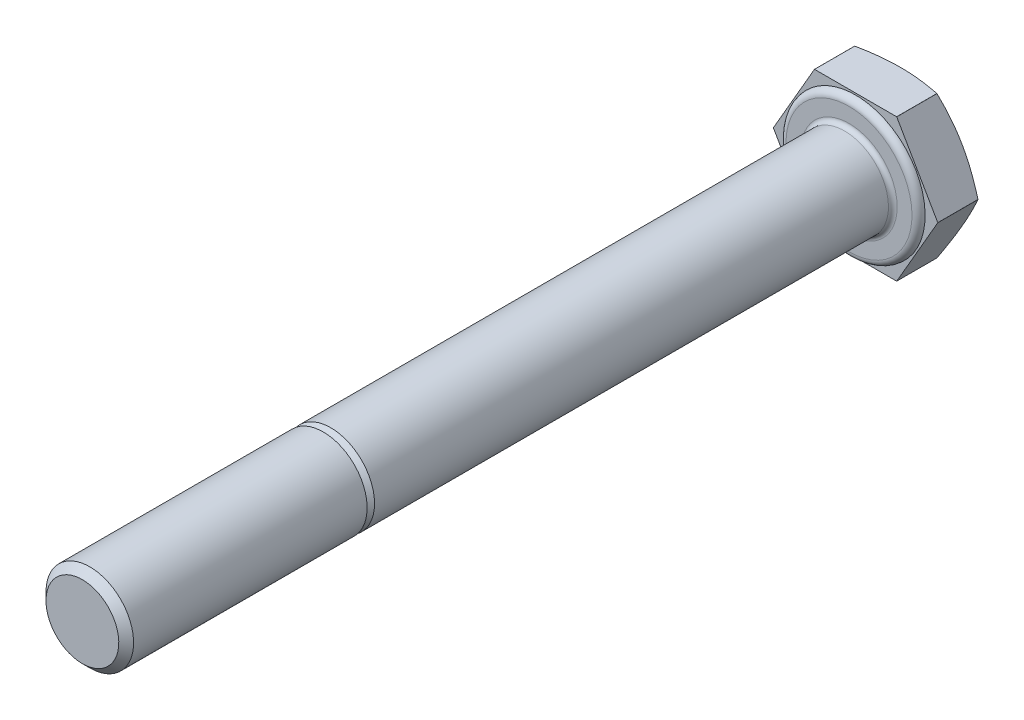
ISO-10303-21;
HEADER;
FILE_DESCRIPTION(('STEP AP214'),'2;1');
FILE_NAME('part.step','',(''),(''),'','','');
FILE_SCHEMA(('AUTOMOTIVE_DESIGN { 1 0 10303 214 1 1 1 1 }'));
ENDSEC;
DATA;
#1=APPLICATION_CONTEXT('core data for automotive mechanical design processes');
#2=APPLICATION_PROTOCOL_DEFINITION('international standard','automotive_design',2000,#1);
#3=PRODUCT_CONTEXT('',#1,'mechanical');
#4=PRODUCT('Part','Part','',(#3));
#5=PRODUCT_RELATED_PRODUCT_CATEGORY('part','',(#4));
#6=PRODUCT_DEFINITION_FORMATION('','',#4);
#7=PRODUCT_DEFINITION_CONTEXT('part definition',#1,'design');
#8=PRODUCT_DEFINITION('design','',#6,#7);
#9=PRODUCT_DEFINITION_SHAPE('','',#8);
#10=(LENGTH_UNIT() NAMED_UNIT(*) SI_UNIT(.MILLI.,.METRE.));
#11=(NAMED_UNIT(*) PLANE_ANGLE_UNIT() SI_UNIT($,.RADIAN.));
#12=(NAMED_UNIT(*) SI_UNIT($,.STERADIAN.) SOLID_ANGLE_UNIT());
#13=UNCERTAINTY_MEASURE_WITH_UNIT(LENGTH_MEASURE(1.E-05),#10,'distance_accuracy_value','');
#14=(GEOMETRIC_REPRESENTATION_CONTEXT(3) GLOBAL_UNCERTAINTY_ASSIGNED_CONTEXT((#13)) GLOBAL_UNIT_ASSIGNED_CONTEXT((#10,
#11,#12)) REPRESENTATION_CONTEXT('',''));
#15=CARTESIAN_POINT('',(0.,0.,0.));
#16=DIRECTION('',(0.,0.,1.));
#17=DIRECTION('',(1.,0.,0.));
#18=AXIS2_PLACEMENT_3D('',#15,#16,#17);
#19=CARTESIAN_POINT('',(0.,0.,47.66171875));
#20=DIRECTION('',(0.,0.,-1.));
#21=DIRECTION('',(1.,0.,0.));
#22=AXIS2_PLACEMENT_3D('',#19,#20,#21);
#23=CONICAL_SURFACE('',#22,3.66171875,0.785398163397449);
#24=CARTESIAN_POINT('',(0.,0.,47.3234375));
#25=DIRECTION('',(0.,0.,-1.));
#26=DIRECTION('',(0.,-1.,0.));
#27=AXIS2_PLACEMENT_3D('',#24,#25,#26);
#28=CIRCLE('',#27,4.);
#29=CARTESIAN_POINT('',(0.,-3.99999999999999,47.3234375));
#30=VERTEX_POINT('',#29);
#31=EDGE_CURVE('E199',#30,#30,#28,.T.);
#32=ORIENTED_EDGE('',*,*,#31,.F.);
#33=EDGE_LOOP('',(#32));
#34=FACE_BOUND('',#33,.T.);
#35=CARTESIAN_POINT('',(0.,0.,48.));
#36=DIRECTION('',(0.,0.,1.));
#37=DIRECTION('',(1.,0.,0.));
#38=AXIS2_PLACEMENT_3D('',#35,#36,#37);
#39=CIRCLE('',#38,3.3234375);
#40=CARTESIAN_POINT('',(3.3234375,0.,48.));
#41=VERTEX_POINT('',#40);
#42=EDGE_CURVE('E11',#41,#41,#39,.T.);
#43=ORIENTED_EDGE('',*,*,#42,.F.);
#44=EDGE_LOOP('',(#43));
#45=FACE_BOUND('',#44,.T.);
#46=ADVANCED_FACE('F17',(#34,#45),#23,.T.);
#47=CARTESIAN_POINT('',(3.66171875,0.,48.));
#48=DIRECTION('',(0.,0.,1.));
#49=DIRECTION('',(0.,-1.,0.));
#50=AXIS2_PLACEMENT_3D('',#47,#48,#49);
#51=PLANE('',#50);
#52=ORIENTED_EDGE('',*,*,#42,.T.);
#53=EDGE_LOOP('',(#52));
#54=FACE_BOUND('',#53,.T.);
#55=CARTESIAN_POINT('',(0.,0.,48.));
#56=DIRECTION('',(0.,0.,1.));
#57=DIRECTION('',(0.,-1.,0.));
#58=AXIS2_PLACEMENT_3D('',#55,#56,#57);
#59=CIRCLE('',#58,4.);
#60=CARTESIAN_POINT('',(0.,-3.99999999999999,48.));
#61=VERTEX_POINT('',#60);
#62=EDGE_CURVE('E27',#61,#61,#59,.T.);
#63=ORIENTED_EDGE('',*,*,#62,.F.);
#64=EDGE_LOOP('',(#63));
#65=FACE_BOUND('',#64,.T.);
#66=ADVANCED_FACE('F19',(#54,#65),#51,.F.);
#67=CARTESIAN_POINT('',(0.,0.,34.86171875));
#68=DIRECTION('',(0.,0.,-1.));
#69=DIRECTION('',(0.,-1.,0.));
#70=AXIS2_PLACEMENT_3D('',#67,#68,#69);
#71=CYLINDRICAL_SURFACE('',#70,4.);
#72=ORIENTED_EDGE('',*,*,#62,.T.);
#73=EDGE_LOOP('',(#72));
#74=FACE_BOUND('',#73,.T.);
#75=CARTESIAN_POINT('',(0.,0.,69.3234375));
#76=DIRECTION('',(0.,0.,1.));
#77=DIRECTION('',(0.,-1.,0.));
#78=AXIS2_PLACEMENT_3D('',#75,#76,#77);
#79=CIRCLE('',#78,4.);
#80=CARTESIAN_POINT('',(0.,-3.99999999999999,69.3234375));
#81=VERTEX_POINT('',#80);
#82=EDGE_CURVE('E178',#81,#81,#79,.T.);
#83=ORIENTED_EDGE('',*,*,#82,.F.);
#84=EDGE_LOOP('',(#83));
#85=FACE_BOUND('',#84,.T.);
#86=ADVANCED_FACE('F397',(#74,#85),#71,.T.);
#87=CARTESIAN_POINT('',(-5.630625,3.25084285945583,-4.7));
#88=DIRECTION('',(-0.866025403784439,0.5,0.));
#89=DIRECTION('',(0.,0.,1.));
#90=AXIS2_PLACEMENT_3D('',#87,#88,#89);
#91=PLANE('',#90);
#92=CARTESIAN_POINT('',(-3.75570076053057,6.49830690255932,-4.27272727272728));
#93=CARTESIAN_POINT('',(-5.630625,3.25084285945584,-5.0296551023286));
#94=CARTESIAN_POINT('',(-7.50554923946943,0.00337881635235375,-4.27272727272728));
#95=(BOUNDED_CURVE() B_SPLINE_CURVE(2,(#92,#93,#94),.UNSPECIFIED.,.F.,
.F.) B_SPLINE_CURVE_WITH_KNOTS((3,3),(0.,7.54343816373168),
.UNSPECIFIED.) CURVE() GEOMETRIC_REPRESENTATION_ITEM() RATIONAL_B_SPLINE_CURVE((1.,
1.15440061616149,1.)) REPRESENTATION_ITEM(''));
#96=CARTESIAN_POINT('',(-3.75570076053057,6.49830690255932,-4.27272727272728));
#97=VERTEX_POINT('',#96);
#98=CARTESIAN_POINT('',(-7.50554923946943,0.0033788163523533,-4.27272727272728));
#99=VERTEX_POINT('',#98);
#100=EDGE_CURVE('E258',#97,#99,#95,.T.);
#101=ORIENTED_EDGE('',*,*,#100,.T.);
#102=DIRECTION('',(0.,0.,1.));
#103=VECTOR('',#102,1.);
#104=CARTESIAN_POINT('',(-7.50554923946943,0.00337881635235485,-2.43636363636363));
#105=LINE('',#104,#103);
#106=CARTESIAN_POINT('',(-7.50554923946943,0.00337881635235508,-0.6));
#107=VERTEX_POINT('',#106);
#108=EDGE_CURVE('E239',#99,#107,#105,.T.);
#109=ORIENTED_EDGE('',*,*,#108,.T.);
#110=DIRECTION('',(0.5,0.866025403784439,0.));
#111=VECTOR('',#110,1.);
#112=CARTESIAN_POINT('',(-7.13053228542569,0.652927234455836,-0.6));
#113=LINE('',#112,#111);
#114=CARTESIAN_POINT('',(-3.75570076053057,6.49830690255932,-0.6));
#115=VERTEX_POINT('',#114);
#116=EDGE_CURVE('E215',#107,#115,#113,.T.);
#117=ORIENTED_EDGE('',*,*,#116,.T.);
#118=DIRECTION('',(0.,0.,-1.));
#119=VECTOR('',#118,1.);
#120=CARTESIAN_POINT('',(-3.75570076053057,6.49830690255932,-2.43636363636363));
#121=LINE('',#120,#119);
#122=EDGE_CURVE('E319',#115,#97,#121,.T.);
#123=ORIENTED_EDGE('',*,*,#122,.T.);
#124=EDGE_LOOP('',(#101,#109,#117,#123));
#125=FACE_BOUND('',#124,.T.);
#126=ADVANCED_FACE('F367',(#125),#91,.T.);
#127=CARTESIAN_POINT('',(0.,6.50168571891167,-4.7));
#128=DIRECTION('',(0.,1.,0.));
#129=DIRECTION('',(0.,0.,-1.));
#130=AXIS2_PLACEMENT_3D('',#127,#128,#129);
#131=PLANE('',#130);
#132=CARTESIAN_POINT('',(3.74984847893885,6.50168571891167,-4.27272727272728));
#133=CARTESIAN_POINT('',(0.,6.50168571891168,-5.02965510232861));
#134=CARTESIAN_POINT('',(-3.74984847893885,6.50168571891167,-4.27272727272728));
#135=(BOUNDED_CURVE() B_SPLINE_CURVE(2,(#132,#133,#134),.UNSPECIFIED.,.F.,
.F.) B_SPLINE_CURVE_WITH_KNOTS((3,3),(0.,7.54343816373169),
.UNSPECIFIED.) CURVE() GEOMETRIC_REPRESENTATION_ITEM() RATIONAL_B_SPLINE_CURVE((1.,
1.15440061616149,1.)) REPRESENTATION_ITEM(''));
#136=CARTESIAN_POINT('',(3.74984847893885,6.50168571891167,-4.27272727272728));
#137=VERTEX_POINT('',#136);
#138=CARTESIAN_POINT('',(-3.74984847893885,6.50168571891167,-4.27272727272728));
#139=VERTEX_POINT('',#138);
#140=EDGE_CURVE('E271',#137,#139,#135,.T.);
#141=ORIENTED_EDGE('',*,*,#140,.T.);
#142=DIRECTION('',(0.,0.,1.));
#143=VECTOR('',#142,1.);
#144=CARTESIAN_POINT('',(-3.74984847893885,6.50168571891167,-2.43636363636363));
#145=LINE('',#144,#143);
#146=CARTESIAN_POINT('',(-3.74984847893885,6.50168571891167,-0.6));
#147=VERTEX_POINT('',#146);
#148=EDGE_CURVE('E322',#139,#147,#145,.T.);
#149=ORIENTED_EDGE('',*,*,#148,.T.);
#150=DIRECTION('',(1.,0.,0.));
#151=VECTOR('',#150,1.);
#152=CARTESIAN_POINT('',(0.,6.50168571891167,-0.599999999999991));
#153=LINE('',#152,#151);
#154=CARTESIAN_POINT('',(3.74984847893885,6.50168571891167,-0.6));
#155=VERTEX_POINT('',#154);
#156=EDGE_CURVE('E190',#147,#155,#153,.T.);
#157=ORIENTED_EDGE('',*,*,#156,.T.);
#158=DIRECTION('',(0.,0.,-1.));
#159=VECTOR('',#158,1.);
#160=CARTESIAN_POINT('',(3.74984847893885,6.50168571891167,-2.43636363636364));
#161=LINE('',#160,#159);
#162=EDGE_CURVE('E329',#155,#137,#161,.T.);
#163=ORIENTED_EDGE('',*,*,#162,.T.);
#164=EDGE_LOOP('',(#141,#149,#157,#163));
#165=FACE_BOUND('',#164,.T.);
#166=ADVANCED_FACE('F375',(#165),#131,.T.);
#167=CARTESIAN_POINT('',(5.630625,3.25084285945583,-4.7));
#168=DIRECTION('',(0.866025403784439,0.5,0.));
#169=DIRECTION('',(0.,0.,-1.));
#170=AXIS2_PLACEMENT_3D('',#167,#168,#169);
#171=PLANE('',#170);
#172=CARTESIAN_POINT('',(7.50554923946943,0.00337881635235375,-4.27272727272728));
#173=CARTESIAN_POINT('',(5.630625,3.25084285945584,-5.0296551023286));
#174=CARTESIAN_POINT('',(3.75570076053058,6.49830690255932,-4.27272727272728));
#175=(BOUNDED_CURVE() B_SPLINE_CURVE(2,(#172,#173,#174),.UNSPECIFIED.,.F.,
.F.) B_SPLINE_CURVE_WITH_KNOTS((3,3),(0.,7.54343816373168),
.UNSPECIFIED.) CURVE() GEOMETRIC_REPRESENTATION_ITEM() RATIONAL_B_SPLINE_CURVE((1.,
1.15440061616149,1.)) REPRESENTATION_ITEM(''));
#176=CARTESIAN_POINT('',(7.50554923946943,0.00337881635235019,-4.27272727272728));
#177=VERTEX_POINT('',#176);
#178=CARTESIAN_POINT('',(3.75570076053057,6.49830690255932,-4.27272727272728));
#179=VERTEX_POINT('',#178);
#180=EDGE_CURVE('E284',#177,#179,#175,.T.);
#181=ORIENTED_EDGE('',*,*,#180,.T.);
#182=DIRECTION('',(0.,0.,1.));
#183=VECTOR('',#182,1.);
#184=CARTESIAN_POINT('',(3.75570076053057,6.49830690255932,-2.43636363636364));
#185=LINE('',#184,#183);
#186=CARTESIAN_POINT('',(3.75570076053058,6.49830690255932,-0.6));
#187=VERTEX_POINT('',#186);
#188=EDGE_CURVE('E332',#179,#187,#185,.T.);
#189=ORIENTED_EDGE('',*,*,#188,.T.);
#190=DIRECTION('',(0.5,-0.866025403784439,0.));
#191=VECTOR('',#190,1.);
#192=CARTESIAN_POINT('',(7.13053228542569,0.652927234455833,-0.6));
#193=LINE('',#192,#191);
#194=CARTESIAN_POINT('',(7.50554923946943,0.00337881635235197,-0.6));
#195=VERTEX_POINT('',#194);
#196=EDGE_CURVE('E244',#187,#195,#193,.T.);
#197=ORIENTED_EDGE('',*,*,#196,.T.);
#198=DIRECTION('',(0.,0.,-1.));
#199=VECTOR('',#198,1.);
#200=CARTESIAN_POINT('',(7.50554923946943,0.00337881635235175,-2.43636363636363));
#201=LINE('',#200,#199);
#202=EDGE_CURVE('E149',#195,#177,#201,.T.);
#203=ORIENTED_EDGE('',*,*,#202,.T.);
#204=EDGE_LOOP('',(#181,#189,#197,#203));
#205=FACE_BOUND('',#204,.T.);
#206=ADVANCED_FACE('F380',(#205),#171,.T.);
#207=CARTESIAN_POINT('',(5.630625,-3.25084285945583,-4.7));
#208=DIRECTION('',(0.866025403784439,-0.5,0.));
#209=DIRECTION('',(0.,0.,-1.));
#210=AXIS2_PLACEMENT_3D('',#207,#208,#209);
#211=PLANE('',#210);
#212=CARTESIAN_POINT('',(3.75570076053057,-6.49830690255932,-4.27272727272728));
#213=CARTESIAN_POINT('',(5.630625,-3.25084285945584,-5.0296551023286));
#214=CARTESIAN_POINT('',(7.50554923946943,-0.00337881635235766,-4.27272727272728));
#215=(BOUNDED_CURVE() B_SPLINE_CURVE(2,(#212,#213,#214),.UNSPECIFIED.,.F.,
.F.) B_SPLINE_CURVE_WITH_KNOTS((3,3),(0.,7.54343816373168),
.UNSPECIFIED.) CURVE() GEOMETRIC_REPRESENTATION_ITEM() RATIONAL_B_SPLINE_CURVE((1.,
1.15440061616149,1.)) REPRESENTATION_ITEM(''));
#216=CARTESIAN_POINT('',(3.75570076053057,-6.49830690255932,-4.27272727272728));
#217=VERTEX_POINT('',#216);
#218=CARTESIAN_POINT('',(7.50554923946943,-0.00337881635235657,-4.27272727272728));
#219=VERTEX_POINT('',#218);
#220=EDGE_CURVE('E166',#217,#219,#215,.T.);
#221=ORIENTED_EDGE('',*,*,#220,.T.);
#222=DIRECTION('',(0.,0.,1.));
#223=VECTOR('',#222,1.);
#224=CARTESIAN_POINT('',(7.50554923946943,-0.00337881635235767,-2.43636363636363));
#225=LINE('',#224,#223);
#226=CARTESIAN_POINT('',(7.50554923946943,-0.00337881635235745,-0.6));
#227=VERTEX_POINT('',#226);
#228=EDGE_CURVE('E21',#219,#227,#225,.T.);
#229=ORIENTED_EDGE('',*,*,#228,.T.);
#230=DIRECTION('',(-0.5,-0.866025403784439,0.));
#231=VECTOR('',#230,1.);
#232=CARTESIAN_POINT('',(4.13071771457431,-5.84875848445584,-0.6));
#233=LINE('',#232,#231);
#234=CARTESIAN_POINT('',(3.75570076053057,-6.49830690255932,-0.6));
#235=VERTEX_POINT('',#234);
#236=EDGE_CURVE('E184',#227,#235,#233,.T.);
#237=ORIENTED_EDGE('',*,*,#236,.T.);
#238=DIRECTION('',(0.,0.,-1.));
#239=VECTOR('',#238,1.);
#240=CARTESIAN_POINT('',(3.75570076053057,-6.49830690255932,-2.43636363636363));
#241=LINE('',#240,#239);
#242=EDGE_CURVE('E150',#235,#217,#241,.T.);
#243=ORIENTED_EDGE('',*,*,#242,.T.);
#244=EDGE_LOOP('',(#221,#229,#237,#243));
#245=FACE_BOUND('',#244,.T.);
#246=ADVANCED_FACE('F344',(#245),#211,.T.);
#247=CARTESIAN_POINT('',(0.,-6.50168571891167,-4.7));
#248=DIRECTION('',(0.,-1.,0.));
#249=DIRECTION('',(-1.,0.,0.));
#250=AXIS2_PLACEMENT_3D('',#247,#248,#249);
#251=PLANE('',#250);
#252=CARTESIAN_POINT('',(-3.74984847893885,-6.50168571891167,-4.27272727272727));
#253=CARTESIAN_POINT('',(0.,-6.50168571891168,-5.0296551023286));
#254=CARTESIAN_POINT('',(3.74984847893885,-6.50168571891167,-4.27272727272728));
#255=(BOUNDED_CURVE() B_SPLINE_CURVE(2,(#252,#253,#254),.UNSPECIFIED.,.F.,
.F.) B_SPLINE_CURVE_WITH_KNOTS((3,3),(0.,7.54343816373169),
.UNSPECIFIED.) CURVE() GEOMETRIC_REPRESENTATION_ITEM() RATIONAL_B_SPLINE_CURVE((1.,
1.15440061616149,1.)) REPRESENTATION_ITEM(''));
#256=CARTESIAN_POINT('',(-3.74984847893885,-6.50168571891167,-4.27272727272727));
#257=VERTEX_POINT('',#256);
#258=CARTESIAN_POINT('',(3.74984847893885,-6.50168571891167,-4.27272727272728));
#259=VERTEX_POINT('',#258);
#260=EDGE_CURVE('E153',#257,#259,#255,.T.);
#261=ORIENTED_EDGE('',*,*,#260,.T.);
#262=DIRECTION('',(0.,0.,1.));
#263=VECTOR('',#262,1.);
#264=CARTESIAN_POINT('',(3.74984847893885,-6.50168571891167,-2.43636363636363));
#265=LINE('',#264,#263);
#266=CARTESIAN_POINT('',(3.74984847893885,-6.50168571891167,-0.6));
#267=VERTEX_POINT('',#266);
#268=EDGE_CURVE('E137',#259,#267,#265,.T.);
#269=ORIENTED_EDGE('',*,*,#268,.T.);
#270=DIRECTION('',(-1.,0.,0.));
#271=VECTOR('',#270,1.);
#272=CARTESIAN_POINT('',(0.,-6.50168571891167,-0.6));
#273=LINE('',#272,#271);
#274=CARTESIAN_POINT('',(-3.74984847893885,-6.50168571891167,-0.6));
#275=VERTEX_POINT('',#274);
#276=EDGE_CURVE('E185',#267,#275,#273,.T.);
#277=ORIENTED_EDGE('',*,*,#276,.T.);
#278=DIRECTION('',(0.,0.,-1.));
#279=VECTOR('',#278,1.);
#280=CARTESIAN_POINT('',(-3.74984847893885,-6.50168571891167,-2.43636363636363));
#281=LINE('',#280,#279);
#282=EDGE_CURVE('E156',#275,#257,#281,.T.);
#283=ORIENTED_EDGE('',*,*,#282,.T.);
#284=EDGE_LOOP('',(#261,#269,#277,#283));
#285=FACE_BOUND('',#284,.T.);
#286=ADVANCED_FACE('F154',(#285),#251,.T.);
#287=CARTESIAN_POINT('',(-5.630625,-3.25084285945583,-4.7));
#288=DIRECTION('',(-0.866025403784439,-0.5,0.));
#289=DIRECTION('',(-0.5,0.866025403784439,0.));
#290=AXIS2_PLACEMENT_3D('',#287,#288,#289);
#291=PLANE('',#290);
#292=CARTESIAN_POINT('',(-7.50554923946943,-0.0033788163523548,-4.27272727272728));
#293=CARTESIAN_POINT('',(-5.630625,-3.25084285945584,-5.0296551023286));
#294=CARTESIAN_POINT('',(-3.75570076053057,-6.49830690255932,-4.27272727272727));
#295=(BOUNDED_CURVE() B_SPLINE_CURVE(2,(#292,#293,#294),.UNSPECIFIED.,.F.,
.F.) B_SPLINE_CURVE_WITH_KNOTS((3,3),(0.,7.54343816373168),
.UNSPECIFIED.) CURVE() GEOMETRIC_REPRESENTATION_ITEM() RATIONAL_B_SPLINE_CURVE((1.,
1.15440061616149,1.)) REPRESENTATION_ITEM(''));
#296=CARTESIAN_POINT('',(-7.50554923946943,-0.00337881635235435,-4.27272727272728));
#297=VERTEX_POINT('',#296);
#298=CARTESIAN_POINT('',(-3.75570076053057,-6.49830690255932,-4.27272727272727));
#299=VERTEX_POINT('',#298);
#300=EDGE_CURVE('E240',#297,#299,#295,.T.);
#301=ORIENTED_EDGE('',*,*,#300,.T.);
#302=DIRECTION('',(0.,0.,1.));
#303=VECTOR('',#302,1.);
#304=CARTESIAN_POINT('',(-3.75570076053057,-6.49830690255932,-2.43636363636363));
#305=LINE('',#304,#303);
#306=CARTESIAN_POINT('',(-3.75570076053057,-6.49830690255932,-0.6));
#307=VERTEX_POINT('',#306);
#308=EDGE_CURVE('E53',#299,#307,#305,.T.);
#309=ORIENTED_EDGE('',*,*,#308,.T.);
#310=DIRECTION('',(-0.5,0.866025403784439,0.));
#311=VECTOR('',#310,1.);
#312=CARTESIAN_POINT('',(-4.13071771457431,-5.84875848445584,-0.6));
#313=LINE('',#312,#311);
#314=CARTESIAN_POINT('',(-7.50554923946943,-0.00337881635235523,-0.6));
#315=VERTEX_POINT('',#314);
#316=EDGE_CURVE('E226',#307,#315,#313,.T.);
#317=ORIENTED_EDGE('',*,*,#316,.T.);
#318=DIRECTION('',(0.,0.,-1.));
#319=VECTOR('',#318,1.);
#320=CARTESIAN_POINT('',(-7.50554923946943,-0.00337881635235545,-2.43636363636363));
#321=LINE('',#320,#319);
#322=EDGE_CURVE('E40',#315,#297,#321,.T.);
#323=ORIENTED_EDGE('',*,*,#322,.T.);
#324=EDGE_LOOP('',(#301,#309,#317,#323));
#325=FACE_BOUND('',#324,.T.);
#326=ADVANCED_FACE('F358',(#325),#291,.T.);
#327=CARTESIAN_POINT('',(0.,0.,-2.43636363636363));
#328=DIRECTION('',(0.,0.,-1.));
#329=DIRECTION('',(0.,-1.,0.));
#330=AXIS2_PLACEMENT_3D('',#327,#328,#329);
#331=CYLINDRICAL_SURFACE('',#330,7.50555);
#332=ORIENTED_EDGE('',*,*,#202,.F.);
#333=CARTESIAN_POINT('',(0.,0.,-0.6));
#334=DIRECTION('',(0.,0.,1.));
#335=DIRECTION('',(0.,-1.,0.));
#336=AXIS2_PLACEMENT_3D('',#333,#334,#335);
#337=CIRCLE('',#336,7.50555);
#338=EDGE_CURVE('E230',#227,#195,#337,.T.);
#339=ORIENTED_EDGE('',*,*,#338,.F.);
#340=ORIENTED_EDGE('',*,*,#228,.F.);
#341=CARTESIAN_POINT('',(0.,0.,-4.27272727272728));
#342=DIRECTION('',(0.,0.,1.));
#343=DIRECTION('',(0.,-1.,0.));
#344=AXIS2_PLACEMENT_3D('',#341,#342,#343);
#345=CIRCLE('',#344,7.50555);
#346=EDGE_CURVE('E172',#219,#177,#345,.T.);
#347=ORIENTED_EDGE('',*,*,#346,.T.);
#348=EDGE_LOOP('',(#332,#339,#340,#347));
#349=FACE_BOUND('',#348,.T.);
#350=ADVANCED_FACE('F347',(#349),#331,.T.);
#351=CARTESIAN_POINT('',(0.,0.,-2.43636363636363));
#352=DIRECTION('',(0.,0.,-1.));
#353=DIRECTION('',(0.,-1.,0.));
#354=AXIS2_PLACEMENT_3D('',#351,#352,#353);
#355=CYLINDRICAL_SURFACE('',#354,7.50555);
#356=ORIENTED_EDGE('',*,*,#242,.F.);
#357=CARTESIAN_POINT('',(0.,0.,-0.6));
#358=DIRECTION('',(0.,0.,1.));
#359=DIRECTION('',(0.,-1.,0.));
#360=AXIS2_PLACEMENT_3D('',#357,#358,#359);
#361=CIRCLE('',#360,7.50555);
#362=EDGE_CURVE('E144',#267,#235,#361,.T.);
#363=ORIENTED_EDGE('',*,*,#362,.F.);
#364=ORIENTED_EDGE('',*,*,#268,.F.);
#365=CARTESIAN_POINT('',(0.,0.,-4.27272727272728));
#366=DIRECTION('',(0.,0.,1.));
#367=DIRECTION('',(0.,-1.,0.));
#368=AXIS2_PLACEMENT_3D('',#365,#366,#367);
#369=CIRCLE('',#368,7.50555);
#370=EDGE_CURVE('E141',#259,#217,#369,.T.);
#371=ORIENTED_EDGE('',*,*,#370,.T.);
#372=EDGE_LOOP('',(#356,#363,#364,#371));
#373=FACE_BOUND('',#372,.T.);
#374=ADVANCED_FACE('F139',(#373),#355,.T.);
#375=CARTESIAN_POINT('',(0.,0.,-2.43636363636363));
#376=DIRECTION('',(0.,0.,-1.));
#377=DIRECTION('',(0.,-1.,0.));
#378=AXIS2_PLACEMENT_3D('',#375,#376,#377);
#379=CYLINDRICAL_SURFACE('',#378,7.50555);
#380=ORIENTED_EDGE('',*,*,#162,.F.);
#381=CARTESIAN_POINT('',(0.,0.,-0.6));
#382=DIRECTION('',(0.,0.,1.));
#383=DIRECTION('',(0.,-1.,0.));
#384=AXIS2_PLACEMENT_3D('',#381,#382,#383);
#385=CIRCLE('',#384,7.50555);
#386=EDGE_CURVE('E195',#187,#155,#385,.T.);
#387=ORIENTED_EDGE('',*,*,#386,.F.);
#388=ORIENTED_EDGE('',*,*,#188,.F.);
#389=CARTESIAN_POINT('',(0.,0.,-4.27272727272728));
#390=DIRECTION('',(0.,0.,1.));
#391=DIRECTION('',(0.,-1.,0.));
#392=AXIS2_PLACEMENT_3D('',#389,#390,#391);
#393=CIRCLE('',#392,7.50555);
#394=EDGE_CURVE('E277',#179,#137,#393,.T.);
#395=ORIENTED_EDGE('',*,*,#394,.T.);
#396=EDGE_LOOP('',(#380,#387,#388,#395));
#397=FACE_BOUND('',#396,.T.);
#398=ADVANCED_FACE('F379',(#397),#379,.T.);
#399=CARTESIAN_POINT('',(0.,0.,-2.43636363636363));
#400=DIRECTION('',(0.,0.,-1.));
#401=DIRECTION('',(0.,-1.,0.));
#402=AXIS2_PLACEMENT_3D('',#399,#400,#401);
#403=CYLINDRICAL_SURFACE('',#402,7.50555);
#404=ORIENTED_EDGE('',*,*,#282,.F.);
#405=CARTESIAN_POINT('',(0.,0.,-0.6));
#406=DIRECTION('',(0.,0.,1.));
#407=DIRECTION('',(0.,-1.,0.));
#408=AXIS2_PLACEMENT_3D('',#405,#406,#407);
#409=CIRCLE('',#408,7.50555);
#410=EDGE_CURVE('E222',#307,#275,#409,.T.);
#411=ORIENTED_EDGE('',*,*,#410,.F.);
#412=ORIENTED_EDGE('',*,*,#308,.F.);
#413=CARTESIAN_POINT('',(0.,0.,-4.27272727272728));
#414=DIRECTION('',(0.,0.,1.));
#415=DIRECTION('',(0.,-1.,0.));
#416=AXIS2_PLACEMENT_3D('',#413,#414,#415);
#417=CIRCLE('',#416,7.50555);
#418=EDGE_CURVE('E160',#299,#257,#417,.T.);
#419=ORIENTED_EDGE('',*,*,#418,.T.);
#420=EDGE_LOOP('',(#404,#411,#412,#419));
#421=FACE_BOUND('',#420,.T.);
#422=ADVANCED_FACE('F360',(#421),#403,.T.);
#423=CARTESIAN_POINT('',(0.,0.,-2.43636363636363));
#424=DIRECTION('',(0.,0.,-1.));
#425=DIRECTION('',(0.,-1.,0.));
#426=AXIS2_PLACEMENT_3D('',#423,#424,#425);
#427=CYLINDRICAL_SURFACE('',#426,7.50555);
#428=ORIENTED_EDGE('',*,*,#122,.F.);
#429=CARTESIAN_POINT('',(0.,0.,-0.6));
#430=DIRECTION('',(0.,0.,1.));
#431=DIRECTION('',(0.,-1.,0.));
#432=AXIS2_PLACEMENT_3D('',#429,#430,#431);
#433=CIRCLE('',#432,7.50555);
#434=EDGE_CURVE('E194',#147,#115,#433,.T.);
#435=ORIENTED_EDGE('',*,*,#434,.F.);
#436=ORIENTED_EDGE('',*,*,#148,.F.);
#437=CARTESIAN_POINT('',(0.,0.,-4.27272727272728));
#438=DIRECTION('',(0.,0.,1.));
#439=DIRECTION('',(0.,-1.,0.));
#440=AXIS2_PLACEMENT_3D('',#437,#438,#439);
#441=CIRCLE('',#440,7.50555);
#442=EDGE_CURVE('E264',#139,#97,#441,.T.);
#443=ORIENTED_EDGE('',*,*,#442,.T.);
#444=EDGE_LOOP('',(#428,#435,#436,#443));
#445=FACE_BOUND('',#444,.T.);
#446=ADVANCED_FACE('F370',(#445),#427,.T.);
#447=CARTESIAN_POINT('',(0.,0.,-2.43636363636363));
#448=DIRECTION('',(0.,0.,-1.));
#449=DIRECTION('',(0.,-1.,0.));
#450=AXIS2_PLACEMENT_3D('',#447,#448,#449);
#451=CYLINDRICAL_SURFACE('',#450,7.50555);
#452=ORIENTED_EDGE('',*,*,#108,.F.);
#453=CARTESIAN_POINT('',(0.,0.,-4.27272727272728));
#454=DIRECTION('',(0.,0.,1.));
#455=DIRECTION('',(0.,-1.,0.));
#456=AXIS2_PLACEMENT_3D('',#453,#454,#455);
#457=CIRCLE('',#456,7.50555);
#458=EDGE_CURVE('E236',#99,#297,#457,.T.);
#459=ORIENTED_EDGE('',*,*,#458,.T.);
#460=ORIENTED_EDGE('',*,*,#322,.F.);
#461=CARTESIAN_POINT('',(0.,0.,-0.6));
#462=DIRECTION('',(0.,0.,1.));
#463=DIRECTION('',(0.,-1.,0.));
#464=AXIS2_PLACEMENT_3D('',#461,#462,#463);
#465=CIRCLE('',#464,7.50555);
#466=EDGE_CURVE('E219',#107,#315,#465,.T.);
#467=ORIENTED_EDGE('',*,*,#466,.F.);
#468=EDGE_LOOP('',(#452,#459,#460,#467));
#469=FACE_BOUND('',#468,.T.);
#470=ADVANCED_FACE('F363',(#469),#451,.T.);
#471=CARTESIAN_POINT('',(0.,0.,-4.48636363636364));
#472=DIRECTION('',(0.,0.,1.));
#473=DIRECTION('',(0.,-1.,0.));
#474=AXIS2_PLACEMENT_3D('',#471,#472,#473);
#475=CONICAL_SURFACE('',#474,6.97678144495198,1.18682389135614);
#476=CARTESIAN_POINT('',(0.,0.,-4.7));
#477=DIRECTION('',(0.,0.,1.));
#478=DIRECTION('',(0.,-1.,0.));
#479=AXIS2_PLACEMENT_3D('',#476,#477,#478);
#480=CIRCLE('',#479,6.44801288990395);
#481=CARTESIAN_POINT('',(0.,-6.44801288990395,-4.7));
#482=VERTEX_POINT('',#481);
#483=EDGE_CURVE('E254',#482,#482,#480,.T.);
#484=ORIENTED_EDGE('',*,*,#483,.T.);
#485=EDGE_LOOP('',(#484));
#486=FACE_BOUND('',#485,.T.);
#487=ORIENTED_EDGE('',*,*,#100,.F.);
#488=ORIENTED_EDGE('',*,*,#442,.F.);
#489=ORIENTED_EDGE('',*,*,#140,.F.);
#490=ORIENTED_EDGE('',*,*,#394,.F.);
#491=ORIENTED_EDGE('',*,*,#180,.F.);
#492=ORIENTED_EDGE('',*,*,#346,.F.);
#493=ORIENTED_EDGE('',*,*,#220,.F.);
#494=ORIENTED_EDGE('',*,*,#370,.F.);
#495=ORIENTED_EDGE('',*,*,#260,.F.);
#496=ORIENTED_EDGE('',*,*,#418,.F.);
#497=ORIENTED_EDGE('',*,*,#300,.F.);
#498=ORIENTED_EDGE('',*,*,#458,.F.);
#499=EDGE_LOOP('',(#487,#488,#489,#490,#491,#492,#493,#494,#495,#496,#497,#498));
#500=FACE_BOUND('',#499,.T.);
#501=ADVANCED_FACE('F163',(#486,#500),#475,.T.);
#502=CARTESIAN_POINT('',(0.,-3.22400644495197,-4.7));
#503=DIRECTION('',(0.,0.,-1.));
#504=DIRECTION('',(0.,-1.,0.));
#505=AXIS2_PLACEMENT_3D('',#502,#503,#504);
#506=PLANE('',#505);
#507=ORIENTED_EDGE('',*,*,#483,.F.);
#508=EDGE_LOOP('',(#507));
#509=FACE_BOUND('',#508,.T.);
#510=ADVANCED_FACE('F410',(#509),#506,.T.);
#511=CARTESIAN_POINT('',(0.,-6.927775,-0.6));
#512=DIRECTION('',(0.,0.,1.));
#513=DIRECTION('',(0.,-1.,0.));
#514=AXIS2_PLACEMENT_3D('',#511,#512,#513);
#515=PLANE('',#514);
#516=ORIENTED_EDGE('',*,*,#116,.F.);
#517=ORIENTED_EDGE('',*,*,#466,.T.);
#518=ORIENTED_EDGE('',*,*,#316,.F.);
#519=ORIENTED_EDGE('',*,*,#410,.T.);
#520=ORIENTED_EDGE('',*,*,#276,.F.);
#521=ORIENTED_EDGE('',*,*,#362,.T.);
#522=ORIENTED_EDGE('',*,*,#236,.F.);
#523=ORIENTED_EDGE('',*,*,#338,.T.);
#524=ORIENTED_EDGE('',*,*,#196,.F.);
#525=ORIENTED_EDGE('',*,*,#386,.T.);
#526=ORIENTED_EDGE('',*,*,#156,.F.);
#527=ORIENTED_EDGE('',*,*,#434,.T.);
#528=EDGE_LOOP('',(#516,#517,#518,#519,#520,#521,#522,#523,#524,#525,#526,#527));
#529=FACE_BOUND('',#528,.T.);
#530=CARTESIAN_POINT('',(0.,0.,-0.6));
#531=DIRECTION('',(0.,0.,1.));
#532=DIRECTION('',(0.,-1.,0.));
#533=AXIS2_PLACEMENT_3D('',#530,#531,#532);
#534=CIRCLE('',#533,6.35);
#535=CARTESIAN_POINT('',(0.,-6.35,-0.599999999999999));
#536=VERTEX_POINT('',#535);
#537=EDGE_CURVE('E211',#536,#536,#534,.T.);
#538=ORIENTED_EDGE('',*,*,#537,.F.);
#539=EDGE_LOOP('',(#538));
#540=FACE_BOUND('',#539,.T.);
#541=ADVANCED_FACE('F351',(#529,#540),#515,.T.);
#542=CARTESIAN_POINT('',(0.,0.,-0.6));
#543=DIRECTION('',(0.,0.,1.));
#544=DIRECTION('',(-1.,0.,0.));
#545=AXIS2_PLACEMENT_3D('',#542,#543,#544);
#546=TOROIDAL_SURFACE('',#545,5.75,0.6);
#547=CARTESIAN_POINT('',(0.,0.,0.));
#548=DIRECTION('',(0.,0.,1.));
#549=DIRECTION('',(0.,-1.,0.));
#550=AXIS2_PLACEMENT_3D('',#547,#548,#549);
#551=CIRCLE('',#550,5.75);
#552=CARTESIAN_POINT('',(0.,-5.75,0.));
#553=VERTEX_POINT('',#552);
#554=EDGE_CURVE('E207',#553,#553,#551,.T.);
#555=ORIENTED_EDGE('',*,*,#554,.F.);
#556=EDGE_LOOP('',(#555));
#557=FACE_BOUND('',#556,.T.);
#558=ORIENTED_EDGE('',*,*,#537,.T.);
#559=EDGE_LOOP('',(#558));
#560=FACE_BOUND('',#559,.T.);
#561=ADVANCED_FACE('F408',(#557,#560),#546,.T.);
#562=CARTESIAN_POINT('',(0.,-5.075,0.));
#563=DIRECTION('',(0.,0.,1.));
#564=DIRECTION('',(0.,-1.,0.));
#565=AXIS2_PLACEMENT_3D('',#562,#563,#564);
#566=PLANE('',#565);
#567=CARTESIAN_POINT('',(0.,0.,0.));
#568=DIRECTION('',(0.,0.,1.));
#569=DIRECTION('',(0.,-1.,0.));
#570=AXIS2_PLACEMENT_3D('',#567,#568,#569);
#571=CIRCLE('',#570,4.4);
#572=CARTESIAN_POINT('',(0.,-4.4,0.));
#573=VERTEX_POINT('',#572);
#574=EDGE_CURVE('E202',#573,#573,#571,.T.);
#575=ORIENTED_EDGE('',*,*,#574,.F.);
#576=EDGE_LOOP('',(#575));
#577=FACE_BOUND('',#576,.T.);
#578=ORIENTED_EDGE('',*,*,#554,.T.);
#579=EDGE_LOOP('',(#578));
#580=FACE_BOUND('',#579,.T.);
#581=ADVANCED_FACE('F405',(#577,#580),#566,.T.);
#582=CARTESIAN_POINT('',(0.,0.,0.4));
#583=DIRECTION('',(0.,0.,1.));
#584=DIRECTION('',(-1.,0.,0.));
#585=AXIS2_PLACEMENT_3D('',#582,#583,#584);
#586=TOROIDAL_SURFACE('',#585,4.4,0.4);
#587=CARTESIAN_POINT('',(0.,0.,0.4));
#588=DIRECTION('',(0.,0.,1.));
#589=DIRECTION('',(0.,-1.,0.));
#590=AXIS2_PLACEMENT_3D('',#587,#588,#589);
#591=CIRCLE('',#590,4.);
#592=CARTESIAN_POINT('',(0.,-4.,0.400000000000001));
#593=VERTEX_POINT('',#592);
#594=EDGE_CURVE('E189',#593,#593,#591,.T.);
#595=ORIENTED_EDGE('',*,*,#594,.F.);
#596=EDGE_LOOP('',(#595));
#597=FACE_BOUND('',#596,.T.);
#598=ORIENTED_EDGE('',*,*,#574,.T.);
#599=EDGE_LOOP('',(#598));
#600=FACE_BOUND('',#599,.T.);
#601=ADVANCED_FACE('F403',(#597,#600),#586,.F.);
#602=CARTESIAN_POINT('',(0.,0.,34.86171875));
#603=DIRECTION('',(0.,0.,-1.));
#604=DIRECTION('',(0.,-1.,0.));
#605=AXIS2_PLACEMENT_3D('',#602,#603,#604);
#606=CYLINDRICAL_SURFACE('',#605,4.);
#607=ORIENTED_EDGE('',*,*,#31,.T.);
#608=EDGE_LOOP('',(#607));
#609=FACE_BOUND('',#608,.T.);
#610=ORIENTED_EDGE('',*,*,#594,.T.);
#611=EDGE_LOOP('',(#610));
#612=FACE_BOUND('',#611,.T.);
#613=ADVANCED_FACE('F510',(#609,#612),#606,.T.);
#614=CARTESIAN_POINT('',(0.,0.,69.66171875));
#615=DIRECTION('',(0.,0.,-1.));
#616=DIRECTION('',(0.,-1.,0.));
#617=AXIS2_PLACEMENT_3D('',#614,#615,#616);
#618=CONICAL_SURFACE('',#617,3.66171875,0.785398163397436);
#619=CARTESIAN_POINT('',(0.,0.,70.));
#620=DIRECTION('',(0.,0.,1.));
#621=DIRECTION('',(0.,-1.,0.));
#622=AXIS2_PLACEMENT_3D('',#619,#620,#621);
#623=CIRCLE('',#622,3.3234375);
#624=CARTESIAN_POINT('',(0.,-3.32343749999999,70.));
#625=VERTEX_POINT('',#624);
#626=EDGE_CURVE('E175',#625,#625,#623,.T.);
#627=ORIENTED_EDGE('',*,*,#626,.F.);
#628=EDGE_LOOP('',(#627));
#629=FACE_BOUND('',#628,.T.);
#630=ORIENTED_EDGE('',*,*,#82,.T.);
#631=EDGE_LOOP('',(#630));
#632=FACE_BOUND('',#631,.T.);
#633=ADVANCED_FACE('F518',(#629,#632),#618,.T.);
#634=CARTESIAN_POINT('',(0.,-1.66171874999999,70.));
#635=DIRECTION('',(0.,0.,1.));
#636=DIRECTION('',(0.,-1.,0.));
#637=AXIS2_PLACEMENT_3D('',#634,#635,#636);
#638=PLANE('',#637);
#639=ORIENTED_EDGE('',*,*,#626,.T.);
#640=EDGE_LOOP('',(#639));
#641=FACE_BOUND('',#640,.T.);
#642=ADVANCED_FACE('F527',(#641),#638,.T.);
#643=CLOSED_SHELL('',(#46,#66,#86,#126,#166,#206,#246,#286,#326,#350,#374,#398,#422,#446,#470,
#501,#510,#541,#561,#581,#601,#613,#633,#642));
#644=MANIFOLD_SOLID_BREP('B1',#643);
#645=ADVANCED_BREP_SHAPE_REPRESENTATION('',(#18,#644),#14);
#646=SHAPE_DEFINITION_REPRESENTATION(#9,#645);
ENDSEC;
END-ISO-10303-21;
